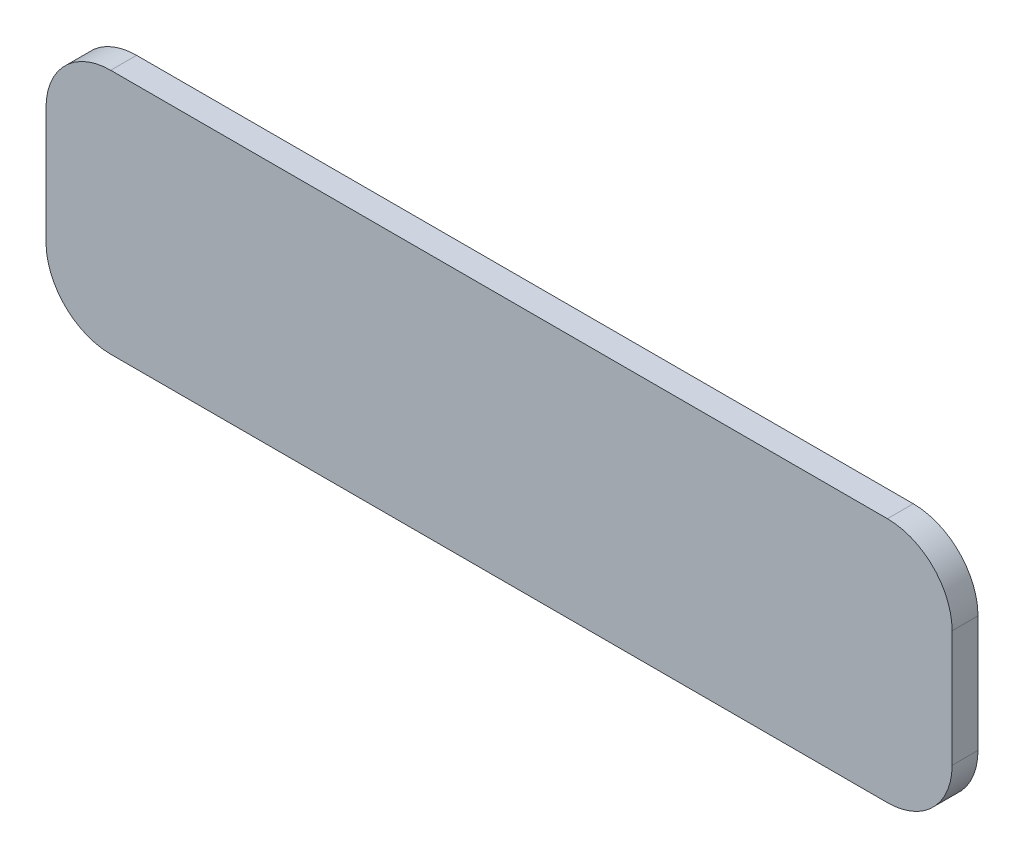
ISO-10303-21;
HEADER;
FILE_DESCRIPTION(('STEP AP214'),'2;1');
FILE_NAME('part.step','',(''),(''),'','','');
FILE_SCHEMA(('AUTOMOTIVE_DESIGN { 1 0 10303 214 1 1 1 1 }'));
ENDSEC;
DATA;
#1=APPLICATION_CONTEXT('core data for automotive mechanical design processes');
#2=APPLICATION_PROTOCOL_DEFINITION('international standard','automotive_design',2000,#1);
#3=PRODUCT_CONTEXT('',#1,'mechanical');
#4=PRODUCT('Part','Part','',(#3));
#5=PRODUCT_RELATED_PRODUCT_CATEGORY('part','',(#4));
#6=PRODUCT_DEFINITION_FORMATION('','',#4);
#7=PRODUCT_DEFINITION_CONTEXT('part definition',#1,'design');
#8=PRODUCT_DEFINITION('design','',#6,#7);
#9=PRODUCT_DEFINITION_SHAPE('','',#8);
#10=(LENGTH_UNIT() NAMED_UNIT(*) SI_UNIT(.MILLI.,.METRE.));
#11=(NAMED_UNIT(*) PLANE_ANGLE_UNIT() SI_UNIT($,.RADIAN.));
#12=(NAMED_UNIT(*) SI_UNIT($,.STERADIAN.) SOLID_ANGLE_UNIT());
#13=UNCERTAINTY_MEASURE_WITH_UNIT(LENGTH_MEASURE(1.E-05),#10,'distance_accuracy_value','');
#14=(GEOMETRIC_REPRESENTATION_CONTEXT(3) GLOBAL_UNCERTAINTY_ASSIGNED_CONTEXT((#13)) GLOBAL_UNIT_ASSIGNED_CONTEXT((#10,
#11,#12)) REPRESENTATION_CONTEXT('',''));
#15=CARTESIAN_POINT('',(0.,0.,0.));
#16=DIRECTION('',(0.,0.,1.));
#17=DIRECTION('',(1.,0.,0.));
#18=AXIS2_PLACEMENT_3D('',#15,#16,#17);
#19=CARTESIAN_POINT('',(5.,5.,2.));
#20=DIRECTION('',(0.,0.,-1.));
#21=DIRECTION('',(-1.,0.,0.));
#22=AXIS2_PLACEMENT_3D('',#19,#20,#21);
#23=CYLINDRICAL_SURFACE('',#22,5.);
#24=CARTESIAN_POINT('',(5.,5.,0.));
#25=DIRECTION('',(0.,0.,1.));
#26=DIRECTION('',(-1.,0.,0.));
#27=AXIS2_PLACEMENT_3D('',#24,#25,#26);
#28=CIRCLE('',#27,5.);
#29=CARTESIAN_POINT('',(0.,5.00000000000004,0.));
#30=VERTEX_POINT('',#29);
#31=CARTESIAN_POINT('',(5.00000000000004,0.,0.));
#32=VERTEX_POINT('',#31);
#33=EDGE_CURVE('E130',#30,#32,#28,.T.);
#34=ORIENTED_EDGE('',*,*,#33,.T.);
#35=DIRECTION('',(0.,0.,-1.));
#36=VECTOR('',#35,1.);
#37=CARTESIAN_POINT('',(5.00000000000004,0.,2.));
#38=LINE('',#37,#36);
#39=CARTESIAN_POINT('',(5.00000000000004,0.,2.));
#40=VERTEX_POINT('',#39);
#41=EDGE_CURVE('E11',#40,#32,#38,.T.);
#42=ORIENTED_EDGE('',*,*,#41,.F.);
#43=CARTESIAN_POINT('',(5.,5.,2.));
#44=DIRECTION('',(0.,0.,1.));
#45=DIRECTION('',(-1.,0.,0.));
#46=AXIS2_PLACEMENT_3D('',#43,#44,#45);
#47=CIRCLE('',#46,5.);
#48=CARTESIAN_POINT('',(0.,5.00000000000004,2.));
#49=VERTEX_POINT('',#48);
#50=EDGE_CURVE('E144',#49,#40,#47,.T.);
#51=ORIENTED_EDGE('',*,*,#50,.F.);
#52=DIRECTION('',(0.,0.,-1.));
#53=VECTOR('',#52,1.);
#54=CARTESIAN_POINT('',(0.,5.00000000000004,2.));
#55=LINE('',#54,#53);
#56=EDGE_CURVE('E126',#49,#30,#55,.T.);
#57=ORIENTED_EDGE('',*,*,#56,.T.);
#58=EDGE_LOOP('',(#34,#42,#51,#57));
#59=FACE_BOUND('',#58,.T.);
#60=ADVANCED_FACE('F34',(#59),#23,.T.);
#61=CARTESIAN_POINT('',(5.00000000000004,0.,2.));
#62=DIRECTION('',(0.,1.,0.));
#63=DIRECTION('',(0.,0.,1.));
#64=AXIS2_PLACEMENT_3D('',#61,#62,#63);
#65=PLANE('',#64);
#66=DIRECTION('',(1.,0.,0.));
#67=VECTOR('',#66,1.);
#68=CARTESIAN_POINT('',(5.00000000000004,0.,0.));
#69=LINE('',#68,#67);
#70=CARTESIAN_POINT('',(65.,0.,0.));
#71=VERTEX_POINT('',#70);
#72=EDGE_CURVE('E133',#32,#71,#69,.T.);
#73=ORIENTED_EDGE('',*,*,#72,.T.);
#74=DIRECTION('',(0.,0.,-1.));
#75=VECTOR('',#74,1.);
#76=CARTESIAN_POINT('',(65.,0.,2.));
#77=LINE('',#76,#75);
#78=CARTESIAN_POINT('',(65.,0.,2.));
#79=VERTEX_POINT('',#78);
#80=EDGE_CURVE('E42',#79,#71,#77,.T.);
#81=ORIENTED_EDGE('',*,*,#80,.F.);
#82=DIRECTION('',(1.,0.,0.));
#83=VECTOR('',#82,1.);
#84=CARTESIAN_POINT('',(5.00000000000004,0.,2.));
#85=LINE('',#84,#83);
#86=EDGE_CURVE('E93',#40,#79,#85,.T.);
#87=ORIENTED_EDGE('',*,*,#86,.F.);
#88=ORIENTED_EDGE('',*,*,#41,.T.);
#89=EDGE_LOOP('',(#73,#81,#87,#88));
#90=FACE_BOUND('',#89,.T.);
#91=ADVANCED_FACE('F179',(#90),#65,.F.);
#92=CARTESIAN_POINT('',(65.,5.,2.));
#93=DIRECTION('',(0.,0.,-1.));
#94=DIRECTION('',(-1.,0.,0.));
#95=AXIS2_PLACEMENT_3D('',#92,#93,#94);
#96=CYLINDRICAL_SURFACE('',#95,5.);
#97=CARTESIAN_POINT('',(65.,5.,0.));
#98=DIRECTION('',(0.,0.,1.));
#99=DIRECTION('',(1.,0.,0.));
#100=AXIS2_PLACEMENT_3D('',#97,#98,#99);
#101=CIRCLE('',#100,5.);
#102=CARTESIAN_POINT('',(70.,5.00000000000004,0.));
#103=VERTEX_POINT('',#102);
#104=EDGE_CURVE('E135',#71,#103,#101,.T.);
#105=ORIENTED_EDGE('',*,*,#104,.T.);
#106=DIRECTION('',(0.,0.,-1.));
#107=VECTOR('',#106,1.);
#108=CARTESIAN_POINT('',(70.,5.00000000000004,2.));
#109=LINE('',#108,#107);
#110=CARTESIAN_POINT('',(70.,5.00000000000004,2.));
#111=VERTEX_POINT('',#110);
#112=EDGE_CURVE('E151',#111,#103,#109,.T.);
#113=ORIENTED_EDGE('',*,*,#112,.F.);
#114=CARTESIAN_POINT('',(65.,5.,2.));
#115=DIRECTION('',(0.,0.,1.));
#116=DIRECTION('',(1.,0.,0.));
#117=AXIS2_PLACEMENT_3D('',#114,#115,#116);
#118=CIRCLE('',#117,5.);
#119=EDGE_CURVE('E159',#79,#111,#118,.T.);
#120=ORIENTED_EDGE('',*,*,#119,.F.);
#121=ORIENTED_EDGE('',*,*,#80,.T.);
#122=EDGE_LOOP('',(#105,#113,#120,#121));
#123=FACE_BOUND('',#122,.T.);
#124=ADVANCED_FACE('F157',(#123),#96,.T.);
#125=CARTESIAN_POINT('',(70.,5.00000000000004,2.));
#126=DIRECTION('',(-1.,0.,0.));
#127=DIRECTION('',(0.,0.,1.));
#128=AXIS2_PLACEMENT_3D('',#125,#126,#127);
#129=PLANE('',#128);
#130=DIRECTION('',(0.,1.,0.));
#131=VECTOR('',#130,1.);
#132=CARTESIAN_POINT('',(70.,5.00000000000004,0.));
#133=LINE('',#132,#131);
#134=CARTESIAN_POINT('',(70.,14.,0.));
#135=VERTEX_POINT('',#134);
#136=EDGE_CURVE('E137',#103,#135,#133,.T.);
#137=ORIENTED_EDGE('',*,*,#136,.T.);
#138=DIRECTION('',(0.,0.,-1.));
#139=VECTOR('',#138,1.);
#140=CARTESIAN_POINT('',(70.,14.,2.));
#141=LINE('',#140,#139);
#142=CARTESIAN_POINT('',(70.,14.,2.));
#143=VERTEX_POINT('',#142);
#144=EDGE_CURVE('E148',#143,#135,#141,.T.);
#145=ORIENTED_EDGE('',*,*,#144,.F.);
#146=DIRECTION('',(0.,1.,0.));
#147=VECTOR('',#146,1.);
#148=CARTESIAN_POINT('',(70.,5.00000000000004,2.));
#149=LINE('',#148,#147);
#150=EDGE_CURVE('E171',#111,#143,#149,.T.);
#151=ORIENTED_EDGE('',*,*,#150,.F.);
#152=ORIENTED_EDGE('',*,*,#112,.T.);
#153=EDGE_LOOP('',(#137,#145,#151,#152));
#154=FACE_BOUND('',#153,.T.);
#155=ADVANCED_FACE('F167',(#154),#129,.F.);
#156=CARTESIAN_POINT('',(65.,14.,2.));
#157=DIRECTION('',(0.,0.,-1.));
#158=DIRECTION('',(-1.,0.,0.));
#159=AXIS2_PLACEMENT_3D('',#156,#157,#158);
#160=CYLINDRICAL_SURFACE('',#159,5.);
#161=CARTESIAN_POINT('',(65.,14.,0.));
#162=DIRECTION('',(0.,0.,1.));
#163=DIRECTION('',(-1.,0.,0.));
#164=AXIS2_PLACEMENT_3D('',#161,#162,#163);
#165=CIRCLE('',#164,5.);
#166=CARTESIAN_POINT('',(65.,19.,0.));
#167=VERTEX_POINT('',#166);
#168=EDGE_CURVE('E139',#135,#167,#165,.T.);
#169=ORIENTED_EDGE('',*,*,#168,.T.);
#170=DIRECTION('',(0.,0.,-1.));
#171=VECTOR('',#170,1.);
#172=CARTESIAN_POINT('',(65.,19.,2.));
#173=LINE('',#172,#171);
#174=CARTESIAN_POINT('',(65.,19.,2.));
#175=VERTEX_POINT('',#174);
#176=EDGE_CURVE('E121',#175,#167,#173,.T.);
#177=ORIENTED_EDGE('',*,*,#176,.F.);
#178=CARTESIAN_POINT('',(65.,14.,2.));
#179=DIRECTION('',(0.,0.,1.));
#180=DIRECTION('',(-1.,0.,0.));
#181=AXIS2_PLACEMENT_3D('',#178,#179,#180);
#182=CIRCLE('',#181,5.);
#183=EDGE_CURVE('E112',#143,#175,#182,.T.);
#184=ORIENTED_EDGE('',*,*,#183,.F.);
#185=ORIENTED_EDGE('',*,*,#144,.T.);
#186=EDGE_LOOP('',(#169,#177,#184,#185));
#187=FACE_BOUND('',#186,.T.);
#188=ADVANCED_FACE('F170',(#187),#160,.T.);
#189=CARTESIAN_POINT('',(5.00000000000004,19.,2.));
#190=DIRECTION('',(0.,-1.,0.));
#191=DIRECTION('',(0.,0.,-1.));
#192=AXIS2_PLACEMENT_3D('',#189,#190,#191);
#193=PLANE('',#192);
#194=DIRECTION('',(-1.,0.,0.));
#195=VECTOR('',#194,1.);
#196=CARTESIAN_POINT('',(5.00000000000004,19.,0.));
#197=LINE('',#196,#195);
#198=CARTESIAN_POINT('',(5.00000000000004,19.,0.));
#199=VERTEX_POINT('',#198);
#200=EDGE_CURVE('E120',#167,#199,#197,.T.);
#201=ORIENTED_EDGE('',*,*,#200,.T.);
#202=DIRECTION('',(0.,0.,-1.));
#203=VECTOR('',#202,1.);
#204=CARTESIAN_POINT('',(5.00000000000004,19.,2.));
#205=LINE('',#204,#203);
#206=CARTESIAN_POINT('',(5.00000000000004,19.,2.));
#207=VERTEX_POINT('',#206);
#208=EDGE_CURVE('E117',#207,#199,#205,.T.);
#209=ORIENTED_EDGE('',*,*,#208,.F.);
#210=DIRECTION('',(-1.,0.,0.));
#211=VECTOR('',#210,1.);
#212=CARTESIAN_POINT('',(5.00000000000004,19.,2.));
#213=LINE('',#212,#211);
#214=EDGE_CURVE('E106',#175,#207,#213,.T.);
#215=ORIENTED_EDGE('',*,*,#214,.F.);
#216=ORIENTED_EDGE('',*,*,#176,.T.);
#217=EDGE_LOOP('',(#201,#209,#215,#216));
#218=FACE_BOUND('',#217,.T.);
#219=ADVANCED_FACE('F118',(#218),#193,.F.);
#220=CARTESIAN_POINT('',(5.,14.,2.));
#221=DIRECTION('',(0.,0.,-1.));
#222=DIRECTION('',(-1.,0.,0.));
#223=AXIS2_PLACEMENT_3D('',#220,#221,#222);
#224=CYLINDRICAL_SURFACE('',#223,5.);
#225=CARTESIAN_POINT('',(5.,14.,0.));
#226=DIRECTION('',(0.,0.,1.));
#227=DIRECTION('',(-1.,0.,0.));
#228=AXIS2_PLACEMENT_3D('',#225,#226,#227);
#229=CIRCLE('',#228,5.);
#230=CARTESIAN_POINT('',(0.,14.,0.));
#231=VERTEX_POINT('',#230);
#232=EDGE_CURVE('E79',#199,#231,#229,.T.);
#233=ORIENTED_EDGE('',*,*,#232,.T.);
#234=DIRECTION('',(0.,0.,-1.));
#235=VECTOR('',#234,1.);
#236=CARTESIAN_POINT('',(0.,14.,2.));
#237=LINE('',#236,#235);
#238=CARTESIAN_POINT('',(0.,14.,2.));
#239=VERTEX_POINT('',#238);
#240=EDGE_CURVE('E122',#239,#231,#237,.T.);
#241=ORIENTED_EDGE('',*,*,#240,.F.);
#242=CARTESIAN_POINT('',(5.,14.,2.));
#243=DIRECTION('',(0.,0.,1.));
#244=DIRECTION('',(-1.,0.,0.));
#245=AXIS2_PLACEMENT_3D('',#242,#243,#244);
#246=CIRCLE('',#245,5.);
#247=EDGE_CURVE('E110',#207,#239,#246,.T.);
#248=ORIENTED_EDGE('',*,*,#247,.F.);
#249=ORIENTED_EDGE('',*,*,#208,.T.);
#250=EDGE_LOOP('',(#233,#241,#248,#249));
#251=FACE_BOUND('',#250,.T.);
#252=ADVANCED_FACE('F124',(#251),#224,.T.);
#253=CARTESIAN_POINT('',(0.,5.00000000000004,2.));
#254=DIRECTION('',(1.,0.,0.));
#255=DIRECTION('',(0.,0.,-1.));
#256=AXIS2_PLACEMENT_3D('',#253,#254,#255);
#257=PLANE('',#256);
#258=DIRECTION('',(0.,-1.,0.));
#259=VECTOR('',#258,1.);
#260=CARTESIAN_POINT('',(0.,5.00000000000004,0.));
#261=LINE('',#260,#259);
#262=EDGE_CURVE('E85',#231,#30,#261,.T.);
#263=ORIENTED_EDGE('',*,*,#262,.T.);
#264=ORIENTED_EDGE('',*,*,#56,.F.);
#265=DIRECTION('',(0.,-1.,0.));
#266=VECTOR('',#265,1.);
#267=CARTESIAN_POINT('',(0.,5.00000000000004,2.));
#268=LINE('',#267,#266);
#269=EDGE_CURVE('E50',#239,#49,#268,.T.);
#270=ORIENTED_EDGE('',*,*,#269,.F.);
#271=ORIENTED_EDGE('',*,*,#240,.T.);
#272=EDGE_LOOP('',(#263,#264,#270,#271));
#273=FACE_BOUND('',#272,.T.);
#274=ADVANCED_FACE('F195',(#273),#257,.F.);
#275=CARTESIAN_POINT('',(5.,5.,2.));
#276=DIRECTION('',(0.,0.,-1.));
#277=DIRECTION('',(-1.,0.,0.));
#278=AXIS2_PLACEMENT_3D('',#275,#276,#277);
#279=PLANE('',#278);
#280=ORIENTED_EDGE('',*,*,#50,.T.);
#281=ORIENTED_EDGE('',*,*,#86,.T.);
#282=ORIENTED_EDGE('',*,*,#119,.T.);
#283=ORIENTED_EDGE('',*,*,#150,.T.);
#284=ORIENTED_EDGE('',*,*,#183,.T.);
#285=ORIENTED_EDGE('',*,*,#214,.T.);
#286=ORIENTED_EDGE('',*,*,#247,.T.);
#287=ORIENTED_EDGE('',*,*,#269,.T.);
#288=EDGE_LOOP('',(#280,#281,#282,#283,#284,#285,#286,#287));
#289=FACE_BOUND('',#288,.T.);
#290=ADVANCED_FACE('F108',(#289),#279,.F.);
#291=CARTESIAN_POINT('',(5.,5.,0.));
#292=DIRECTION('',(0.,0.,-1.));
#293=DIRECTION('',(-1.,0.,0.));
#294=AXIS2_PLACEMENT_3D('',#291,#292,#293);
#295=PLANE('',#294);
#296=ORIENTED_EDGE('',*,*,#33,.F.);
#297=ORIENTED_EDGE('',*,*,#262,.F.);
#298=ORIENTED_EDGE('',*,*,#232,.F.);
#299=ORIENTED_EDGE('',*,*,#200,.F.);
#300=ORIENTED_EDGE('',*,*,#168,.F.);
#301=ORIENTED_EDGE('',*,*,#136,.F.);
#302=ORIENTED_EDGE('',*,*,#104,.F.);
#303=ORIENTED_EDGE('',*,*,#72,.F.);
#304=EDGE_LOOP('',(#296,#297,#298,#299,#300,#301,#302,#303));
#305=FACE_BOUND('',#304,.T.);
#306=ADVANCED_FACE('F163',(#305),#295,.T.);
#307=CLOSED_SHELL('',(#60,#91,#124,#155,#188,#219,#252,#274,#290,#306));
#308=MANIFOLD_SOLID_BREP('B2',#307);
#309=ADVANCED_BREP_SHAPE_REPRESENTATION('',(#18,#308),#14);
#310=SHAPE_DEFINITION_REPRESENTATION(#9,#309);
ENDSEC;
END-ISO-10303-21;
